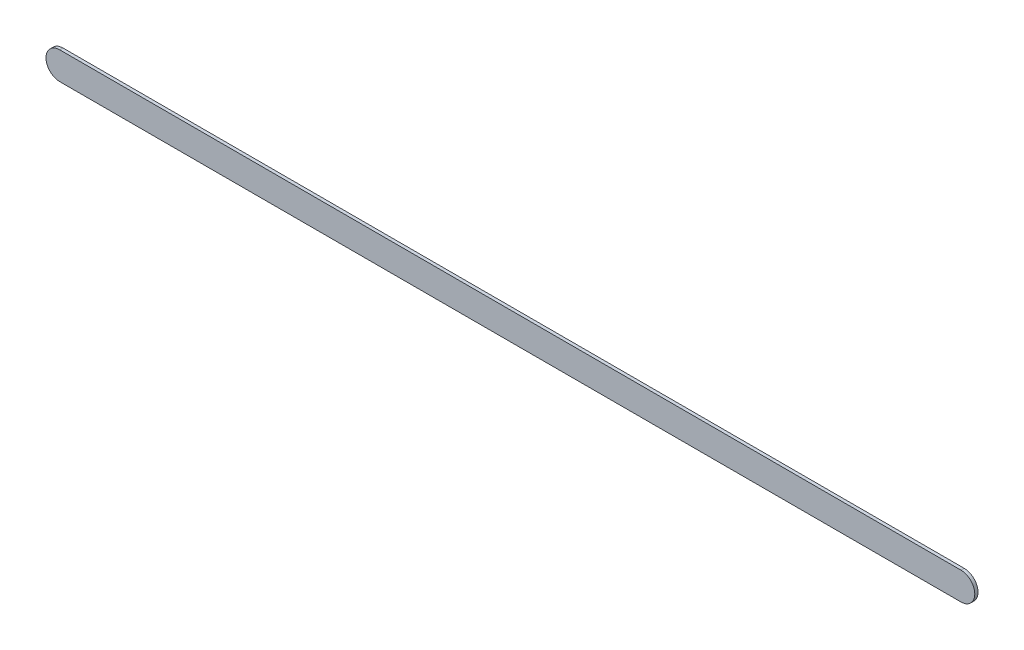
ISO-10303-21;
HEADER;
FILE_DESCRIPTION(('STEP AP214'),'2;1');
FILE_NAME('part.step','',(''),(''),'','','');
FILE_SCHEMA(('AUTOMOTIVE_DESIGN { 1 0 10303 214 1 1 1 1 }'));
ENDSEC;
DATA;
#1=APPLICATION_CONTEXT('core data for automotive mechanical design processes');
#2=APPLICATION_PROTOCOL_DEFINITION('international standard','automotive_design',2000,#1);
#3=PRODUCT_CONTEXT('',#1,'mechanical');
#4=PRODUCT('Part','Part','',(#3));
#5=PRODUCT_RELATED_PRODUCT_CATEGORY('part','',(#4));
#6=PRODUCT_DEFINITION_FORMATION('','',#4);
#7=PRODUCT_DEFINITION_CONTEXT('part definition',#1,'design');
#8=PRODUCT_DEFINITION('design','',#6,#7);
#9=PRODUCT_DEFINITION_SHAPE('','',#8);
#10=(LENGTH_UNIT() NAMED_UNIT(*) SI_UNIT(.MILLI.,.METRE.));
#11=(NAMED_UNIT(*) PLANE_ANGLE_UNIT() SI_UNIT($,.RADIAN.));
#12=(NAMED_UNIT(*) SI_UNIT($,.STERADIAN.) SOLID_ANGLE_UNIT());
#13=UNCERTAINTY_MEASURE_WITH_UNIT(LENGTH_MEASURE(1.E-05),#10,'distance_accuracy_value','');
#14=(GEOMETRIC_REPRESENTATION_CONTEXT(3) GLOBAL_UNCERTAINTY_ASSIGNED_CONTEXT((#13)) GLOBAL_UNIT_ASSIGNED_CONTEXT((#10,
#11,#12)) REPRESENTATION_CONTEXT('',''));
#15=CARTESIAN_POINT('',(0.,0.,0.));
#16=DIRECTION('',(0.,0.,1.));
#17=DIRECTION('',(1.,0.,0.));
#18=AXIS2_PLACEMENT_3D('',#15,#16,#17);
#19=CARTESIAN_POINT('',(102.715,-121.925,1.635));
#20=DIRECTION('',(0.,0.,1.));
#21=DIRECTION('',(1.,0.,0.));
#22=AXIS2_PLACEMENT_3D('',#19,#20,#21);
#23=PLANE('',#22);
#24=DIRECTION('',(-1.,0.,0.));
#25=VECTOR('',#24,1.);
#26=CARTESIAN_POINT('',(102.715,-121.925,1.635));
#27=LINE('',#26,#25);
#28=CARTESIAN_POINT('',(102.715,-121.925,1.635));
#29=VERTEX_POINT('',#28);
#30=CARTESIAN_POINT('',(92.91,-121.925,1.635));
#31=VERTEX_POINT('',#30);
#32=EDGE_CURVE('E100',#29,#31,#27,.T.);
#33=ORIENTED_EDGE('',*,*,#32,.T.);
#34=CARTESIAN_POINT('',(92.91,-122.075,1.635));
#35=DIRECTION('',(0.,0.,1.));
#36=DIRECTION('',(0.,1.,0.));
#37=AXIS2_PLACEMENT_3D('',#34,#35,#36);
#38=CIRCLE('',#37,0.15);
#39=CARTESIAN_POINT('',(92.91,-122.225,1.635));
#40=VERTEX_POINT('',#39);
#41=EDGE_CURVE('E79',#31,#40,#38,.T.);
#42=ORIENTED_EDGE('',*,*,#41,.T.);
#43=DIRECTION('',(1.,0.,0.));
#44=VECTOR('',#43,1.);
#45=CARTESIAN_POINT('',(92.91,-122.225,1.635));
#46=LINE('',#45,#44);
#47=CARTESIAN_POINT('',(102.715,-122.225,1.635));
#48=VERTEX_POINT('',#47);
#49=EDGE_CURVE('E84',#40,#48,#46,.T.);
#50=ORIENTED_EDGE('',*,*,#49,.T.);
#51=CARTESIAN_POINT('',(102.715,-122.075,1.635));
#52=DIRECTION('',(0.,0.,1.));
#53=DIRECTION('',(0.,-1.,0.));
#54=AXIS2_PLACEMENT_3D('',#51,#52,#53);
#55=CIRCLE('',#54,0.15);
#56=EDGE_CURVE('E11',#48,#29,#55,.T.);
#57=ORIENTED_EDGE('',*,*,#56,.T.);
#58=EDGE_LOOP('',(#33,#42,#50,#57));
#59=FACE_BOUND('',#58,.T.);
#60=ADVANCED_FACE('F17',(#59),#23,.T.);
#61=CARTESIAN_POINT('',(102.715,-121.925,1.6));
#62=DIRECTION('',(0.,0.,1.));
#63=DIRECTION('',(1.,0.,0.));
#64=AXIS2_PLACEMENT_3D('',#61,#62,#63);
#65=PLANE('',#64);
#66=CARTESIAN_POINT('',(102.715,-122.075,1.6));
#67=DIRECTION('',(0.,0.,1.));
#68=DIRECTION('',(0.,-1.,0.));
#69=AXIS2_PLACEMENT_3D('',#66,#67,#68);
#70=CIRCLE('',#69,0.15);
#71=CARTESIAN_POINT('',(102.715,-122.225,1.6));
#72=VERTEX_POINT('',#71);
#73=CARTESIAN_POINT('',(102.715,-121.925,1.6));
#74=VERTEX_POINT('',#73);
#75=EDGE_CURVE('E20',#72,#74,#70,.T.);
#76=ORIENTED_EDGE('',*,*,#75,.F.);
#77=DIRECTION('',(1.,0.,0.));
#78=VECTOR('',#77,1.);
#79=CARTESIAN_POINT('',(92.91,-122.225,1.6));
#80=LINE('',#79,#78);
#81=CARTESIAN_POINT('',(92.91,-122.225,1.6));
#82=VERTEX_POINT('',#81);
#83=EDGE_CURVE('E67',#82,#72,#80,.T.);
#84=ORIENTED_EDGE('',*,*,#83,.F.);
#85=CARTESIAN_POINT('',(92.91,-122.075,1.6));
#86=DIRECTION('',(0.,0.,1.));
#87=DIRECTION('',(0.,1.,0.));
#88=AXIS2_PLACEMENT_3D('',#85,#86,#87);
#89=CIRCLE('',#88,0.15);
#90=CARTESIAN_POINT('',(92.91,-121.925,1.6));
#91=VERTEX_POINT('',#90);
#92=EDGE_CURVE('E72',#91,#82,#89,.T.);
#93=ORIENTED_EDGE('',*,*,#92,.F.);
#94=DIRECTION('',(-1.,0.,0.));
#95=VECTOR('',#94,1.);
#96=CARTESIAN_POINT('',(102.715,-121.925,1.6));
#97=LINE('',#96,#95);
#98=EDGE_CURVE('E117',#74,#91,#97,.T.);
#99=ORIENTED_EDGE('',*,*,#98,.F.);
#100=EDGE_LOOP('',(#76,#84,#93,#99));
#101=FACE_BOUND('',#100,.T.);
#102=ADVANCED_FACE('F69',(#101),#65,.F.);
#103=CARTESIAN_POINT('',(102.715,-122.075,1.6));
#104=DIRECTION('',(0.,0.,-1.));
#105=DIRECTION('',(0.,-1.,0.));
#106=AXIS2_PLACEMENT_3D('',#103,#104,#105);
#107=CYLINDRICAL_SURFACE('',#106,0.15);
#108=ORIENTED_EDGE('',*,*,#75,.T.);
#109=DIRECTION('',(0.,0.,1.));
#110=VECTOR('',#109,1.);
#111=CARTESIAN_POINT('',(102.715,-121.925,1.6));
#112=LINE('',#111,#110);
#113=EDGE_CURVE('E94',#74,#29,#112,.T.);
#114=ORIENTED_EDGE('',*,*,#113,.T.);
#115=ORIENTED_EDGE('',*,*,#56,.F.);
#116=DIRECTION('',(0.,0.,1.));
#117=VECTOR('',#116,1.);
#118=CARTESIAN_POINT('',(102.715,-122.225,1.6));
#119=LINE('',#118,#117);
#120=EDGE_CURVE('E78',#72,#48,#119,.T.);
#121=ORIENTED_EDGE('',*,*,#120,.F.);
#122=EDGE_LOOP('',(#108,#114,#115,#121));
#123=FACE_BOUND('',#122,.T.);
#124=ADVANCED_FACE('F113',(#123),#107,.T.);
#125=CARTESIAN_POINT('',(92.91,-122.225,1.6));
#126=DIRECTION('',(0.,1.,0.));
#127=DIRECTION('',(1.,0.,0.));
#128=AXIS2_PLACEMENT_3D('',#125,#126,#127);
#129=PLANE('',#128);
#130=ORIENTED_EDGE('',*,*,#83,.T.);
#131=ORIENTED_EDGE('',*,*,#120,.T.);
#132=ORIENTED_EDGE('',*,*,#49,.F.);
#133=DIRECTION('',(0.,0.,1.));
#134=VECTOR('',#133,1.);
#135=CARTESIAN_POINT('',(92.91,-122.225,1.6));
#136=LINE('',#135,#134);
#137=EDGE_CURVE('E82',#82,#40,#136,.T.);
#138=ORIENTED_EDGE('',*,*,#137,.F.);
#139=EDGE_LOOP('',(#130,#131,#132,#138));
#140=FACE_BOUND('',#139,.T.);
#141=ADVANCED_FACE('F83',(#140),#129,.F.);
#142=CARTESIAN_POINT('',(92.91,-122.075,1.6));
#143=DIRECTION('',(0.,0.,-1.));
#144=DIRECTION('',(0.,1.,0.));
#145=AXIS2_PLACEMENT_3D('',#142,#143,#144);
#146=CYLINDRICAL_SURFACE('',#145,0.15);
#147=ORIENTED_EDGE('',*,*,#92,.T.);
#148=ORIENTED_EDGE('',*,*,#137,.T.);
#149=ORIENTED_EDGE('',*,*,#41,.F.);
#150=DIRECTION('',(0.,0.,1.));
#151=VECTOR('',#150,1.);
#152=CARTESIAN_POINT('',(92.91,-121.925,1.6));
#153=LINE('',#152,#151);
#154=EDGE_CURVE('E91',#91,#31,#153,.T.);
#155=ORIENTED_EDGE('',*,*,#154,.F.);
#156=EDGE_LOOP('',(#147,#148,#149,#155));
#157=FACE_BOUND('',#156,.T.);
#158=ADVANCED_FACE('F89',(#157),#146,.T.);
#159=CARTESIAN_POINT('',(102.715,-121.925,1.6));
#160=DIRECTION('',(0.,-1.,0.));
#161=DIRECTION('',(0.,0.,-1.));
#162=AXIS2_PLACEMENT_3D('',#159,#160,#161);
#163=PLANE('',#162);
#164=ORIENTED_EDGE('',*,*,#98,.T.);
#165=ORIENTED_EDGE('',*,*,#154,.T.);
#166=ORIENTED_EDGE('',*,*,#32,.F.);
#167=ORIENTED_EDGE('',*,*,#113,.F.);
#168=EDGE_LOOP('',(#164,#165,#166,#167));
#169=FACE_BOUND('',#168,.T.);
#170=ADVANCED_FACE('F116',(#169),#163,.F.);
#171=CLOSED_SHELL('',(#60,#102,#124,#141,#158,#170));
#172=MANIFOLD_SOLID_BREP('B1',#171);
#173=ADVANCED_BREP_SHAPE_REPRESENTATION('',(#18,#172),#14);
#174=SHAPE_DEFINITION_REPRESENTATION(#9,#173);
ENDSEC;
END-ISO-10303-21;
